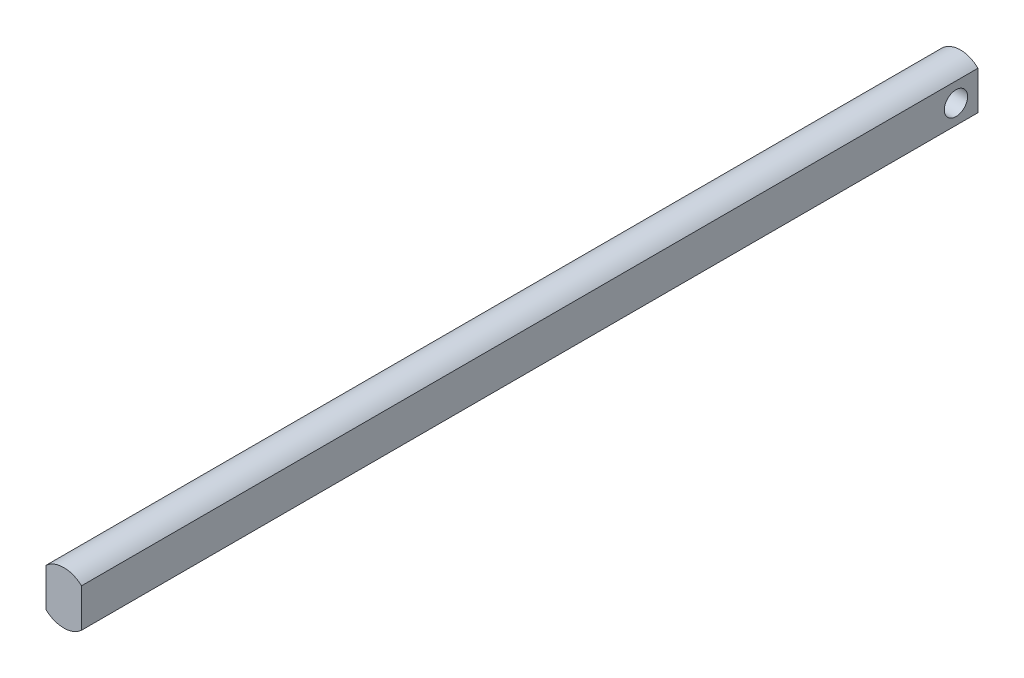
ISO-10303-21;
HEADER;
FILE_DESCRIPTION(('STEP AP214'),'2;1');
FILE_NAME('part.step','',(''),(''),'','','');
FILE_SCHEMA(('AUTOMOTIVE_DESIGN { 1 0 10303 214 1 1 1 1 }'));
ENDSEC;
DATA;
#1=APPLICATION_CONTEXT('core data for automotive mechanical design processes');
#2=APPLICATION_PROTOCOL_DEFINITION('international standard','automotive_design',2000,#1);
#3=PRODUCT_CONTEXT('',#1,'mechanical');
#4=PRODUCT('Part','Part','',(#3));
#5=PRODUCT_RELATED_PRODUCT_CATEGORY('part','',(#4));
#6=PRODUCT_DEFINITION_FORMATION('','',#4);
#7=PRODUCT_DEFINITION_CONTEXT('part definition',#1,'design');
#8=PRODUCT_DEFINITION('design','',#6,#7);
#9=PRODUCT_DEFINITION_SHAPE('','',#8);
#10=(LENGTH_UNIT() NAMED_UNIT(*) SI_UNIT(.MILLI.,.METRE.));
#11=(NAMED_UNIT(*) PLANE_ANGLE_UNIT() SI_UNIT($,.RADIAN.));
#12=(NAMED_UNIT(*) SI_UNIT($,.STERADIAN.) SOLID_ANGLE_UNIT());
#13=UNCERTAINTY_MEASURE_WITH_UNIT(LENGTH_MEASURE(1.E-05),#10,'distance_accuracy_value','');
#14=(GEOMETRIC_REPRESENTATION_CONTEXT(3) GLOBAL_UNCERTAINTY_ASSIGNED_CONTEXT((#13)) GLOBAL_UNIT_ASSIGNED_CONTEXT((#10,
#11,#12)) REPRESENTATION_CONTEXT('',''));
#15=CARTESIAN_POINT('',(0.,0.,0.));
#16=DIRECTION('',(0.,0.,1.));
#17=DIRECTION('',(1.,0.,0.));
#18=AXIS2_PLACEMENT_3D('',#15,#16,#17);
#19=CARTESIAN_POINT('',(3.05,-4.5,8.29));
#20=DIRECTION('',(-1.,0.,0.));
#21=DIRECTION('',(0.,0.,1.));
#22=AXIS2_PLACEMENT_3D('',#19,#20,#21);
#23=PLANE('',#22);
#24=CARTESIAN_POINT('',(3.05,0.,3.79));
#25=DIRECTION('',(1.,0.,0.));
#26=DIRECTION('',(0.,0.,-1.));
#27=AXIS2_PLACEMENT_3D('',#24,#25,#26);
#28=CIRCLE('',#27,2.);
#29=CARTESIAN_POINT('',(3.05,0.,1.79));
#30=VERTEX_POINT('',#29);
#31=EDGE_CURVE('E121',#30,#30,#28,.T.);
#32=ORIENTED_EDGE('',*,*,#31,.F.);
#33=EDGE_LOOP('',(#32));
#34=FACE_BOUND('',#33,.T.);
#35=DIRECTION('',(0.,0.,-1.));
#36=VECTOR('',#35,1.);
#37=CARTESIAN_POINT('',(3.05,3.30870065131314,8.29));
#38=LINE('',#37,#36);
#39=CARTESIAN_POINT('',(3.05,3.30870065131314,153.99));
#40=VERTEX_POINT('',#39);
#41=CARTESIAN_POINT('',(3.05,3.30870065131314,0.));
#42=VERTEX_POINT('',#41);
#43=EDGE_CURVE('E87',#40,#42,#38,.T.);
#44=ORIENTED_EDGE('',*,*,#43,.F.);
#45=DIRECTION('',(0.,1.,0.));
#46=VECTOR('',#45,1.);
#47=CARTESIAN_POINT('',(3.05,-3.30870065131314,153.99));
#48=LINE('',#47,#46);
#49=CARTESIAN_POINT('',(3.05,-3.30870065131314,153.99));
#50=VERTEX_POINT('',#49);
#51=EDGE_CURVE('E116',#50,#40,#48,.T.);
#52=ORIENTED_EDGE('',*,*,#51,.F.);
#53=DIRECTION('',(0.,0.,-1.));
#54=VECTOR('',#53,1.);
#55=CARTESIAN_POINT('',(3.05,-3.30870065131314,8.29));
#56=LINE('',#55,#54);
#57=CARTESIAN_POINT('',(3.05,-3.30870065131314,0.));
#58=VERTEX_POINT('',#57);
#59=EDGE_CURVE('E90',#50,#58,#56,.T.);
#60=ORIENTED_EDGE('',*,*,#59,.T.);
#61=DIRECTION('',(0.,1.,0.));
#62=VECTOR('',#61,1.);
#63=CARTESIAN_POINT('',(3.05,-4.5,0.));
#64=LINE('',#63,#62);
#65=EDGE_CURVE('E107',#58,#42,#64,.T.);
#66=ORIENTED_EDGE('',*,*,#65,.T.);
#67=EDGE_LOOP('',(#44,#52,#60,#66));
#68=FACE_BOUND('',#67,.T.);
#69=ADVANCED_FACE('F46',(#34,#68),#23,.F.);
#70=CARTESIAN_POINT('',(-3.05,-4.5,8.29));
#71=DIRECTION('',(1.,0.,0.));
#72=DIRECTION('',(0.,0.,-1.));
#73=AXIS2_PLACEMENT_3D('',#70,#71,#72);
#74=PLANE('',#73);
#75=CARTESIAN_POINT('',(-3.05,0.,3.79));
#76=DIRECTION('',(1.,0.,0.));
#77=DIRECTION('',(0.,0.,-1.));
#78=AXIS2_PLACEMENT_3D('',#75,#76,#77);
#79=CIRCLE('',#78,2.);
#80=CARTESIAN_POINT('',(-3.05,0.,1.79));
#81=VERTEX_POINT('',#80);
#82=EDGE_CURVE('E124',#81,#81,#79,.T.);
#83=ORIENTED_EDGE('',*,*,#82,.T.);
#84=EDGE_LOOP('',(#83));
#85=FACE_BOUND('',#84,.T.);
#86=DIRECTION('',(0.,0.,-1.));
#87=VECTOR('',#86,1.);
#88=CARTESIAN_POINT('',(-3.05,3.30870065131314,8.29));
#89=LINE('',#88,#87);
#90=CARTESIAN_POINT('',(-3.05,3.30870065131314,153.99));
#91=VERTEX_POINT('',#90);
#92=CARTESIAN_POINT('',(-3.05,3.30870065131314,0.));
#93=VERTEX_POINT('',#92);
#94=EDGE_CURVE('E99',#91,#93,#89,.T.);
#95=ORIENTED_EDGE('',*,*,#94,.T.);
#96=DIRECTION('',(0.,-1.,0.));
#97=VECTOR('',#96,1.);
#98=CARTESIAN_POINT('',(-3.05,-4.5,0.));
#99=LINE('',#98,#97);
#100=CARTESIAN_POINT('',(-3.05,-3.30870065131314,0.));
#101=VERTEX_POINT('',#100);
#102=EDGE_CURVE('E130',#93,#101,#99,.T.);
#103=ORIENTED_EDGE('',*,*,#102,.T.);
#104=DIRECTION('',(0.,0.,-1.));
#105=VECTOR('',#104,1.);
#106=CARTESIAN_POINT('',(-3.05,-3.30870065131314,8.29));
#107=LINE('',#106,#105);
#108=CARTESIAN_POINT('',(-3.05,-3.30870065131314,153.99));
#109=VERTEX_POINT('',#108);
#110=EDGE_CURVE('E71',#109,#101,#107,.T.);
#111=ORIENTED_EDGE('',*,*,#110,.F.);
#112=DIRECTION('',(0.,-1.,0.));
#113=VECTOR('',#112,1.);
#114=CARTESIAN_POINT('',(-3.05,3.30870065131314,153.99));
#115=LINE('',#114,#113);
#116=EDGE_CURVE('E110',#91,#109,#115,.T.);
#117=ORIENTED_EDGE('',*,*,#116,.F.);
#118=EDGE_LOOP('',(#95,#103,#111,#117));
#119=FACE_BOUND('',#118,.T.);
#120=ADVANCED_FACE('F111',(#85,#119),#74,.F.);
#121=CARTESIAN_POINT('',(-3.05,3.30870065131314,0.));
#122=CARTESIAN_POINT('',(-1.23455109934349,4.98220325264542,0.));
#123=CARTESIAN_POINT('',(1.23455109934349,4.98220325264542,0.));
#124=CARTESIAN_POINT('',(3.05,3.30870065131314,0.));
#125=CARTESIAN_POINT('',(-3.05,1.10290021710438,0.));
#126=CARTESIAN_POINT('',(-1.23455109934349,1.66073441754847,-1.76184871079418));
#127=CARTESIAN_POINT('',(1.23455109934349,1.66073441754847,-1.7804688856893));
#128=CARTESIAN_POINT('',(3.05,1.10290021710438,0.));
#129=CARTESIAN_POINT('',(-3.05,-1.10290021710438,0.));
#130=CARTESIAN_POINT('',(-1.23455109934349,-1.66073441754847,-1.76184871079418));
#131=CARTESIAN_POINT('',(1.23455109934349,-1.66073441754847,-1.80694480383345));
#132=CARTESIAN_POINT('',(3.05,-1.10290021710438,0.));
#133=CARTESIAN_POINT('',(-3.05,-3.30870065131314,0.));
#134=CARTESIAN_POINT('',(-1.23455109934348,-4.98220325264542,0.));
#135=CARTESIAN_POINT('',(1.23455109934349,-4.98220325264542,0.));
#136=CARTESIAN_POINT('',(3.05,-3.30870065131314,0.));
#137=B_SPLINE_SURFACE_WITH_KNOTS('',3,3,((#121,#122,#123,#124),(#125,#126,#127,#128),(#129,#130,
#131,#132),(#133,#134,#135,#136)),.UNSPECIFIED.,.F.,.F.,.F.,(4,4),(4,4),(0.,1.),(0.,1.),.UNSPECIFIED.);
#138=CARTESIAN_POINT('',(-3.05,3.30870065131314,0.));
#139=CARTESIAN_POINT('',(-3.00351476826556,3.35155121616989,6.8393285929854E-06));
#140=CARTESIAN_POINT('',(-2.95613203301046,3.3934169211989,-7.43523282075663E-07));
#141=CARTESIAN_POINT('',(-2.85964533513492,3.47511520758696,-0.000102790350090848));
#142=CARTESIAN_POINT('',(-2.8105413759589,3.51494779301417,-0.000197254151173035));
#143=CARTESIAN_POINT('',(-2.66078655109792,3.63127887345678,-0.000697926347035206));
#144=CARTESIAN_POINT('',(-2.55766611496461,3.70463522824974,-0.00132134538650396));
#145=CARTESIAN_POINT('',(-2.3457066535814,3.84234665144179,-0.00317844298011829));
#146=CARTESIAN_POINT('',(-2.23687163364177,3.90670791157774,-0.00441169907524038));
#147=CARTESIAN_POINT('',(-2.01417498291058,4.0260471372016,-0.00728688613281132));
#148=CARTESIAN_POINT('',(-1.90031338842636,4.08102517045137,-0.00892881414378655));
#149=CARTESIAN_POINT('',(-1.66828606796659,4.18124436823614,-0.0123550588162249));
#150=CARTESIAN_POINT('',(-1.55011721851597,4.22647829555816,-0.0141394799721729));
#151=CARTESIAN_POINT('',(-1.31038818606995,4.3068392791211,-0.0175859719669713));
#152=CARTESIAN_POINT('',(-1.1888279729154,4.3419662454501,-0.0192480417172808));
#153=CARTESIAN_POINT('',(-0.943233116565867,4.40184959855568,-0.022228519043125));
#154=CARTESIAN_POINT('',(-0.81919960924277,4.42661063602598,-0.0235470806337421));
#155=CARTESIAN_POINT('',(-0.569437874244056,4.46561551615885,-0.0256811340640181));
#156=CARTESIAN_POINT('',(-0.443709032009618,4.47985543453552,-0.0264964381743748));
#157=CARTESIAN_POINT('',(-0.191497803706536,4.49770059569127,-0.0275289894325155));
#158=CARTESIAN_POINT('',(-0.0650154261526161,4.50130595841013,-0.0277462433252912));
#159=CARTESIAN_POINT('',(0.187860774845498,4.49785561495752,-0.0275578096229345));
#160=CARTESIAN_POINT('',(0.314254532125046,4.49079507363243,-0.0271518395015129));
#161=CARTESIAN_POINT('',(0.566017500705422,4.46605265024558,-0.0257615465275444));
#162=CARTESIAN_POINT('',(0.691386525672749,4.44836887820941,-0.0247771207628837));
#163=CARTESIAN_POINT('',(0.940185250755608,4.40250528982409,-0.0223446027828877));
#164=CARTESIAN_POINT('',(1.06361494723377,4.37432545379116,-0.0208965096980156));
#165=CARTESIAN_POINT('',(1.30761933214112,4.30768168706688,-0.0177181971569103));
#166=CARTESIAN_POINT('',(1.42819492694496,4.2692210702552,-0.0159880686812087));
#167=CARTESIAN_POINT('',(1.66563429680745,4.18230072978873,-0.0124839867526943));
#168=CARTESIAN_POINT('',(1.78249945695603,4.13384478921552,-0.0107100501035864));
#169=CARTESIAN_POINT('',(2.01163909520341,4.02731399239196,-0.00739159843201713));
#170=CARTESIAN_POINT('',(2.12391748354065,3.96924755189142,-0.00584688490779003));
#171=CARTESIAN_POINT('',(2.34315420377411,3.84389973609605,-0.0032458482756189));
#172=CARTESIAN_POINT('',(2.45011471863274,3.77662218521046,-0.00218932326646736));
#173=CARTESIAN_POINT('',(2.64131920814735,3.64481370703797,-0.00083032202225225));
#174=CARTESIAN_POINT('',(2.72645433340993,3.5815742615213,-0.000434054297199673));
#175=CARTESIAN_POINT('',(2.85056605248868,3.48239470851749,-0.000120162277155823));
#176=CARTESIAN_POINT('',(2.89130674458292,3.44864372451336,-6.22172371995764E-05));
#177=CARTESIAN_POINT('',(2.9715748638613,3.37972498590038,-3.59736546771943E-07));
#178=CARTESIAN_POINT('',(3.01110223645481,3.34455716770834,3.55029650909061E-06));
#179=CARTESIAN_POINT('',(3.05,3.30870065131314,0.));
#180=B_SPLINE_CURVE_WITH_KNOTS('',3,(#138,#139,#140,#141,#142,#143,#144,#145,#146,#147,#148,
#149,#150,#151,#152,#153,#154,#155,#156,#157,#158,#159,#160,#161,#162,#163,#164,#165,#166,#167,
#168,#169,#170,#171,#172,#173,#174,#175,#176,#177,#178,#179),.UNSPECIFIED.,.F.,.F.,(4,2,2,2,2,2,
2,2,2,2,2,2,2,2,2,2,2,2,2,2,4),(0.,0.189637353227103,0.379274326984698,0.758440009335225,
1.13734339533303,1.51624404492822,1.89542515140129,2.27460963098021,2.65362380592799,
3.03277927859753,3.41193047501901,3.79125360290506,4.17064423600008,4.55003558058802,
4.92930478033507,5.30843069484789,5.68722635499291,6.06586521524959,6.38374804167501,
6.54243392654634,6.70112694070443),.UNSPECIFIED.);
#181=EDGE_CURVE('E12',#93,#42,#180,.T.);
#182=CARTESIAN_POINT('',(3.05,-3.30870065131314,0.));
#183=CARTESIAN_POINT('',(3.00351660696869,-3.35154952136899,7.05612526128928E-06));
#184=CARTESIAN_POINT('',(2.95613577867728,-3.39341361165207,-7.66355680747938E-07));
#185=CARTESIAN_POINT('',(2.85965302850774,-3.47510883136412,-0.000105307812425301));
#186=CARTESIAN_POINT('',(2.81055111000237,-3.51493996477661,-0.000202026614030512));
#187=CARTESIAN_POINT('',(2.66080266908126,-3.63126688568044,-0.000714138265505084));
#188=CARTESIAN_POINT('',(2.55768678243964,-3.70462078079064,-0.00135141467952861));
#189=CARTESIAN_POINT('',(2.34573704711694,-3.84232792364904,-0.00324561729724305));
#190=CARTESIAN_POINT('',(2.23690720691784,-3.90668736817126,-0.00450211415736255));
#191=CARTESIAN_POINT('',(2.01422133893117,-4.02602377535987,-0.00742568362656292));
#192=CARTESIAN_POINT('',(1.90036534734095,-4.08100080558272,-0.00909275327917438));
#193=CARTESIAN_POINT('',(1.66838180927784,-4.18120493721787,-0.0125639177329618));
#194=CARTESIAN_POINT('',(1.55025231683087,-4.22642752991448,-0.0143680753804437));
#195=CARTESIAN_POINT('',(1.31060365992274,-4.30677251932076,-0.0178448118677822));
#196=CARTESIAN_POINT('',(1.18908446664986,-4.34189483015154,-0.0195173895887767));
#197=CARTESIAN_POINT('',(0.943572436489146,-4.4017757112552,-0.0225081226291138));
#198=CARTESIAN_POINT('',(0.819580735877404,-4.42653893221417,-0.0238264368988278));
#199=CARTESIAN_POINT('',(0.569902632500723,-4.46555508276037,-0.0259501127028759));
#200=CARTESIAN_POINT('',(0.444215615250747,-4.47980409111348,-0.0267552828468877));
#201=CARTESIAN_POINT('',(0.192049986562724,-4.49767696346038,-0.0277604824309599));
#202=CARTESIAN_POINT('',(0.065571160386626,-4.50129780783798,-0.0279603398933839));
#203=CARTESIAN_POINT('',(-0.187299170263039,-4.49787894867102,-0.0277332211138814));
#204=CARTESIAN_POINT('',(-0.31369060910079,-4.49083440858283,-0.0273059604888282));
#205=CARTESIAN_POINT('',(-0.565450432905323,-4.46612439610034,-0.0258732777184652));
#206=CARTESIAN_POINT('',(-0.690818630136834,-4.44845701722981,-0.0248677517935455));
#207=CARTESIAN_POINT('',(-0.939617111587347,-4.40262649226826,-0.0223969057251588));
#208=CARTESIAN_POINT('',(-1.06304739209433,-4.37446332607544,-0.0209315847010815));
#209=CARTESIAN_POINT('',(-1.30705718186909,-4.30785228151773,-0.0177251923789461));
#210=CARTESIAN_POINT('',(-1.42763753472373,-4.26940748911342,-0.0159842038844721));
#211=CARTESIAN_POINT('',(-1.66508783247898,-4.18251831542502,-0.0124655696550629));
#212=CARTESIAN_POINT('',(-1.78195916197261,-4.13407771750532,-0.010687938017852));
#213=CARTESIAN_POINT('',(-2.01111253771935,-4.02757696108697,-0.00736787593501968));
#214=CARTESIAN_POINT('',(-2.12339849098631,-3.96952521445998,-0.00582524206181005));
#215=CARTESIAN_POINT('',(-2.34265156763837,-3.84420608865226,-0.00323071451721333));
#216=CARTESIAN_POINT('',(-2.44962087163828,-3.77694253090792,-0.00217861814378853));
#217=CARTESIAN_POINT('',(-2.64092344189061,-3.64510333046785,-0.000825516722232208));
#218=CARTESIAN_POINT('',(-2.72614373885546,-3.58181358080074,-0.000431402719852725));
#219=CARTESIAN_POINT('',(-2.85037687552269,-3.48255029939208,-0.000119346839967044));
#220=CARTESIAN_POINT('',(-2.89115696008378,-3.44877004878893,-6.17817053575193E-05));
#221=CARTESIAN_POINT('',(-2.9715016560061,-3.37979011797959,-3.55141913985734E-07));
#222=CARTESIAN_POINT('',(-3.01106621281578,-3.34459037423158,3.50388015106623E-06));
#223=CARTESIAN_POINT('',(-3.05,-3.30870065131314,0.));
#224=B_SPLINE_CURVE_WITH_KNOTS('',3,(#182,#183,#184,#185,#186,#187,#188,#189,#190,#191,#192,
#193,#194,#195,#196,#197,#198,#199,#200,#201,#202,#203,#204,#205,#206,#207,#208,#209,#210,#211,
#212,#213,#214,#215,#216,#217,#218,#219,#220,#221,#222,#223),.UNSPECIFIED.,.F.,.F.,(4,2,2,2,2,2,
2,2,2,2,2,2,2,2,2,2,2,2,2,2,4),(0.,0.189629859501795,0.37925934741408,0.758409831551135,
1.1372977964539,1.51618303312443,1.89524302537469,2.27430624053342,2.65319909314926,
3.03223318103971,3.41137494761689,3.79068869908949,4.17007054616324,4.54945311984238,
4.92872195195318,5.30784749507478,5.68664295716251,6.06528175271232,6.38345883799112,
6.54229166280115,6.70113160547287),.UNSPECIFIED.);
#225=EDGE_CURVE('E63',#58,#101,#224,.T.);
#226=ORIENTED_EDGE('',*,*,#102,.F.);
#227=ORIENTED_EDGE('',*,*,#181,.T.);
#228=ORIENTED_EDGE('',*,*,#65,.F.);
#229=ORIENTED_EDGE('',*,*,#225,.T.);
#230=EDGE_LOOP('',(#226,#227,#228,#229));
#231=FACE_BOUND('',#230,.T.);
#232=ADVANCED_FACE('F48',(#231),#137,.F.);
#233=CARTESIAN_POINT('',(0.,0.,8.29));
#234=DIRECTION('',(0.,0.,-1.));
#235=DIRECTION('',(-1.,0.,0.));
#236=AXIS2_PLACEMENT_3D('',#233,#234,#235);
#237=CYLINDRICAL_SURFACE('',#236,4.5);
#238=ORIENTED_EDGE('',*,*,#59,.F.);
#239=CARTESIAN_POINT('',(0.,0.,153.99));
#240=DIRECTION('',(0.,0.,1.));
#241=DIRECTION('',(1.,0.,0.));
#242=AXIS2_PLACEMENT_3D('',#239,#240,#241);
#243=CIRCLE('',#242,4.5);
#244=EDGE_CURVE('E113',#109,#50,#243,.T.);
#245=ORIENTED_EDGE('',*,*,#244,.F.);
#246=ORIENTED_EDGE('',*,*,#110,.T.);
#247=ORIENTED_EDGE('',*,*,#225,.F.);
#248=EDGE_LOOP('',(#238,#245,#246,#247));
#249=FACE_BOUND('',#248,.T.);
#250=ADVANCED_FACE('F137',(#249),#237,.T.);
#251=CARTESIAN_POINT('',(0.,0.,8.29));
#252=DIRECTION('',(0.,0.,-1.));
#253=DIRECTION('',(-1.,0.,0.));
#254=AXIS2_PLACEMENT_3D('',#251,#252,#253);
#255=CYLINDRICAL_SURFACE('',#254,4.5);
#256=ORIENTED_EDGE('',*,*,#94,.F.);
#257=CARTESIAN_POINT('',(0.,0.,153.99));
#258=DIRECTION('',(0.,0.,1.));
#259=DIRECTION('',(1.,0.,0.));
#260=AXIS2_PLACEMENT_3D('',#257,#258,#259);
#261=CIRCLE('',#260,4.5);
#262=EDGE_CURVE('E103',#40,#91,#261,.T.);
#263=ORIENTED_EDGE('',*,*,#262,.F.);
#264=ORIENTED_EDGE('',*,*,#43,.T.);
#265=ORIENTED_EDGE('',*,*,#181,.F.);
#266=EDGE_LOOP('',(#256,#263,#264,#265));
#267=FACE_BOUND('',#266,.T.);
#268=ADVANCED_FACE('F101',(#267),#255,.T.);
#269=CARTESIAN_POINT('',(-3.05,0.,3.79));
#270=DIRECTION('',(1.,0.,0.));
#271=DIRECTION('',(0.,0.,-1.));
#272=AXIS2_PLACEMENT_3D('',#269,#270,#271);
#273=CYLINDRICAL_SURFACE('',#272,2.);
#274=ORIENTED_EDGE('',*,*,#82,.F.);
#275=EDGE_LOOP('',(#274));
#276=FACE_BOUND('',#275,.T.);
#277=ORIENTED_EDGE('',*,*,#31,.T.);
#278=EDGE_LOOP('',(#277));
#279=FACE_BOUND('',#278,.T.);
#280=ADVANCED_FACE('F141',(#276,#279),#273,.F.);
#281=CARTESIAN_POINT('',(0.,0.,153.99));
#282=DIRECTION('',(0.,0.,1.));
#283=DIRECTION('',(1.,0.,0.));
#284=AXIS2_PLACEMENT_3D('',#281,#282,#283);
#285=PLANE('',#284);
#286=ORIENTED_EDGE('',*,*,#262,.T.);
#287=ORIENTED_EDGE('',*,*,#116,.T.);
#288=ORIENTED_EDGE('',*,*,#244,.T.);
#289=ORIENTED_EDGE('',*,*,#51,.T.);
#290=EDGE_LOOP('',(#286,#287,#288,#289));
#291=FACE_BOUND('',#290,.T.);
#292=ADVANCED_FACE('F115',(#291),#285,.T.);
#293=CLOSED_SHELL('',(#69,#120,#232,#250,#268,#280,#292));
#294=MANIFOLD_SOLID_BREP('B2',#293);
#295=ADVANCED_BREP_SHAPE_REPRESENTATION('',(#18,#294),#14);
#296=SHAPE_DEFINITION_REPRESENTATION(#9,#295);
ENDSEC;
END-ISO-10303-21;
